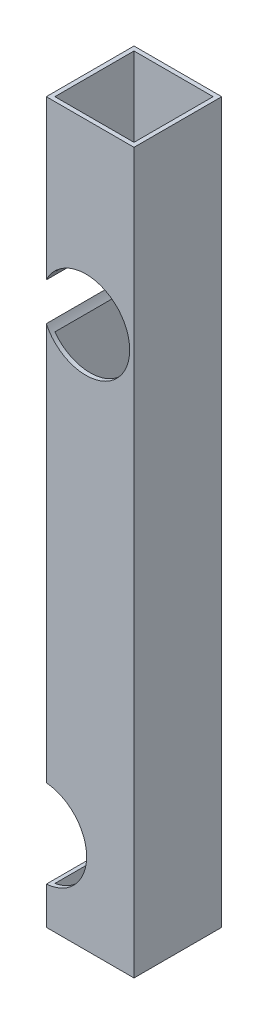
ISO-10303-21;
HEADER;
FILE_DESCRIPTION(('STEP AP214'),'2;1');
FILE_NAME('part.step','',(''),(''),'','','');
FILE_SCHEMA(('AUTOMOTIVE_DESIGN { 1 0 10303 214 1 1 1 1 }'));
ENDSEC;
DATA;
#1=APPLICATION_CONTEXT('core data for automotive mechanical design processes');
#2=APPLICATION_PROTOCOL_DEFINITION('international standard','automotive_design',2000,#1);
#3=PRODUCT_CONTEXT('',#1,'mechanical');
#4=PRODUCT('Part','Part','',(#3));
#5=PRODUCT_RELATED_PRODUCT_CATEGORY('part','',(#4));
#6=PRODUCT_DEFINITION_FORMATION('','',#4);
#7=PRODUCT_DEFINITION_CONTEXT('part definition',#1,'design');
#8=PRODUCT_DEFINITION('design','',#6,#7);
#9=PRODUCT_DEFINITION_SHAPE('','',#8);
#10=(LENGTH_UNIT() NAMED_UNIT(*) SI_UNIT(.MILLI.,.METRE.));
#11=(NAMED_UNIT(*) PLANE_ANGLE_UNIT() SI_UNIT($,.RADIAN.));
#12=(NAMED_UNIT(*) SI_UNIT($,.STERADIAN.) SOLID_ANGLE_UNIT());
#13=UNCERTAINTY_MEASURE_WITH_UNIT(LENGTH_MEASURE(1.E-05),#10,'distance_accuracy_value','');
#14=(GEOMETRIC_REPRESENTATION_CONTEXT(3) GLOBAL_UNCERTAINTY_ASSIGNED_CONTEXT((#13)) GLOBAL_UNIT_ASSIGNED_CONTEXT((#10,
#11,#12)) REPRESENTATION_CONTEXT('',''));
#15=CARTESIAN_POINT('',(0.,0.,0.));
#16=DIRECTION('',(0.,0.,1.));
#17=DIRECTION('',(1.,0.,0.));
#18=AXIS2_PLACEMENT_3D('',#15,#16,#17);
#19=CARTESIAN_POINT('',(-12.7,208.28,12.7));
#20=DIRECTION('',(1.,0.,0.));
#21=DIRECTION('',(0.,0.,-1.));
#22=AXIS2_PLACEMENT_3D('',#19,#20,#21);
#23=PLANE('',#22);
#24=DIRECTION('',(0.,-1.,0.));
#25=VECTOR('',#24,1.);
#26=CARTESIAN_POINT('',(-12.7,208.28,-12.7));
#27=LINE('',#26,#25);
#28=CARTESIAN_POINT('',(-12.7,151.361952413119,-12.7));
#29=VERTEX_POINT('',#28);
#30=CARTESIAN_POINT('',(-12.7,36.2618843829871,-12.7));
#31=VERTEX_POINT('',#30);
#32=EDGE_CURVE('E198',#29,#31,#27,.T.);
#33=ORIENTED_EDGE('',*,*,#32,.T.);
#34=DIRECTION('',(0.,0.,1.));
#35=VECTOR('',#34,1.);
#36=CARTESIAN_POINT('',(-12.7,36.2618843829871,-196.85));
#37=LINE('',#36,#35);
#38=CARTESIAN_POINT('',(-12.7,36.2618843829871,12.7));
#39=VERTEX_POINT('',#38);
#40=EDGE_CURVE('E276',#31,#39,#37,.T.);
#41=ORIENTED_EDGE('',*,*,#40,.T.);
#42=DIRECTION('',(0.,-1.,0.));
#43=VECTOR('',#42,1.);
#44=CARTESIAN_POINT('',(-12.7,208.28,12.7));
#45=LINE('',#44,#43);
#46=CARTESIAN_POINT('',(-12.7,151.361952413119,12.7));
#47=VERTEX_POINT('',#46);
#48=EDGE_CURVE('E193',#47,#39,#45,.T.);
#49=ORIENTED_EDGE('',*,*,#48,.F.);
#50=DIRECTION('',(0.,0.,1.));
#51=VECTOR('',#50,1.);
#52=CARTESIAN_POINT('',(-12.7,151.361952413119,-196.85));
#53=LINE('',#52,#51);
#54=EDGE_CURVE('E71',#47,#29,#53,.F.);
#55=ORIENTED_EDGE('',*,*,#54,.T.);
#56=EDGE_LOOP('',(#33,#41,#49,#55));
#57=FACE_BOUND('',#56,.T.);
#58=ADVANCED_FACE('F47',(#57),#23,.F.);
#59=CARTESIAN_POINT('',(-12.7,208.28,-12.7));
#60=VERTEX_POINT('',#59);
#61=CARTESIAN_POINT('',(-12.7,162.328047586881,-12.7));
#62=VERTEX_POINT('',#61);
#63=EDGE_CURVE('E183',#60,#62,#27,.T.);
#64=ORIENTED_EDGE('',*,*,#63,.T.);
#65=DIRECTION('',(0.,0.,1.));
#66=VECTOR('',#65,1.);
#67=CARTESIAN_POINT('',(-12.7,162.328047586881,-196.85));
#68=LINE('',#67,#66);
#69=CARTESIAN_POINT('',(-12.7,162.328047586881,12.7));
#70=VERTEX_POINT('',#69);
#71=EDGE_CURVE('E166',#62,#70,#68,.T.);
#72=ORIENTED_EDGE('',*,*,#71,.T.);
#73=CARTESIAN_POINT('',(-12.7,208.28,12.7));
#74=VERTEX_POINT('',#73);
#75=EDGE_CURVE('E180',#74,#70,#45,.T.);
#76=ORIENTED_EDGE('',*,*,#75,.F.);
#77=DIRECTION('',(0.,0.,1.));
#78=VECTOR('',#77,1.);
#79=CARTESIAN_POINT('',(-12.7,208.28,12.7));
#80=LINE('',#79,#78);
#81=EDGE_CURVE('E212',#60,#74,#80,.T.);
#82=ORIENTED_EDGE('',*,*,#81,.F.);
#83=EDGE_LOOP('',(#64,#72,#76,#82));
#84=FACE_BOUND('',#83,.T.);
#85=ADVANCED_FACE('F178',(#84),#23,.F.);
#86=CARTESIAN_POINT('',(-11.4554,208.28,11.4554));
#87=DIRECTION('',(1.,0.,0.));
#88=DIRECTION('',(0.,0.,-1.));
#89=AXIS2_PLACEMENT_3D('',#86,#87,#88);
#90=PLANE('',#89);
#91=DIRECTION('',(0.,0.,1.));
#92=VECTOR('',#91,1.);
#93=CARTESIAN_POINT('',(-11.4554,36.0948876326499,-196.85));
#94=LINE('',#93,#92);
#95=CARTESIAN_POINT('',(-11.4554,36.0948876326499,-11.4554));
#96=VERTEX_POINT('',#95);
#97=CARTESIAN_POINT('',(-11.4554,36.0948876326499,11.4554));
#98=VERTEX_POINT('',#97);
#99=EDGE_CURVE('E301',#96,#98,#94,.T.);
#100=ORIENTED_EDGE('',*,*,#99,.F.);
#101=DIRECTION('',(0.,-1.,0.));
#102=VECTOR('',#101,1.);
#103=CARTESIAN_POINT('',(-11.4554,208.28,-11.4554));
#104=LINE('',#103,#102);
#105=CARTESIAN_POINT('',(-11.4554,149.293207937185,-11.4554));
#106=VERTEX_POINT('',#105);
#107=EDGE_CURVE('E257',#106,#96,#104,.T.);
#108=ORIENTED_EDGE('',*,*,#107,.F.);
#109=DIRECTION('',(0.,0.,1.));
#110=VECTOR('',#109,1.);
#111=CARTESIAN_POINT('',(-11.4554,149.293207937185,-196.85));
#112=LINE('',#111,#110);
#113=CARTESIAN_POINT('',(-11.4554,149.293207937185,11.4554));
#114=VERTEX_POINT('',#113);
#115=EDGE_CURVE('E317',#114,#106,#112,.F.);
#116=ORIENTED_EDGE('',*,*,#115,.F.);
#117=DIRECTION('',(0.,-1.,0.));
#118=VECTOR('',#117,1.);
#119=CARTESIAN_POINT('',(-11.4554,208.28,11.4554));
#120=LINE('',#119,#118);
#121=EDGE_CURVE('E241',#114,#98,#120,.T.);
#122=ORIENTED_EDGE('',*,*,#121,.T.);
#123=EDGE_LOOP('',(#100,#108,#116,#122));
#124=FACE_BOUND('',#123,.T.);
#125=ADVANCED_FACE('F370',(#124),#90,.T.);
#126=DIRECTION('',(0.,0.,1.));
#127=VECTOR('',#126,1.);
#128=CARTESIAN_POINT('',(-11.4554,164.396792062815,-196.85));
#129=LINE('',#128,#127);
#130=CARTESIAN_POINT('',(-11.4554,164.396792062815,-11.4554));
#131=VERTEX_POINT('',#130);
#132=CARTESIAN_POINT('',(-11.4554,164.396792062815,11.4554));
#133=VERTEX_POINT('',#132);
#134=EDGE_CURVE('E314',#131,#133,#129,.T.);
#135=ORIENTED_EDGE('',*,*,#134,.F.);
#136=CARTESIAN_POINT('',(-11.4554,208.28,-11.4554));
#137=VERTEX_POINT('',#136);
#138=EDGE_CURVE('E253',#137,#131,#104,.T.);
#139=ORIENTED_EDGE('',*,*,#138,.F.);
#140=DIRECTION('',(0.,0.,1.));
#141=VECTOR('',#140,1.);
#142=CARTESIAN_POINT('',(-11.4554,208.28,11.4554));
#143=LINE('',#142,#141);
#144=CARTESIAN_POINT('',(-11.4554,208.28,11.4554));
#145=VERTEX_POINT('',#144);
#146=EDGE_CURVE('E263',#137,#145,#143,.T.);
#147=ORIENTED_EDGE('',*,*,#146,.T.);
#148=EDGE_CURVE('E228',#145,#133,#120,.T.);
#149=ORIENTED_EDGE('',*,*,#148,.T.);
#150=EDGE_LOOP('',(#135,#139,#147,#149));
#151=FACE_BOUND('',#150,.T.);
#152=ADVANCED_FACE('F344',(#151),#90,.T.);
#153=CARTESIAN_POINT('',(11.4554,208.28,11.4554));
#154=DIRECTION('',(0.,0.,-1.));
#155=DIRECTION('',(-1.,0.,0.));
#156=AXIS2_PLACEMENT_3D('',#153,#154,#155);
#157=PLANE('',#156);
#158=CARTESIAN_POINT('',(-1.2446,156.845,11.4554));
#159=DIRECTION('',(0.,0.,-1.));
#160=DIRECTION('',(-1.,0.,0.));
#161=AXIS2_PLACEMENT_3D('',#158,#159,#160);
#162=CIRCLE('',#161,12.7);
#163=CARTESIAN_POINT('',(11.4554,156.845,11.4554));
#164=VERTEX_POINT('',#163);
#165=EDGE_CURVE('E310',#133,#164,#162,.T.);
#166=ORIENTED_EDGE('',*,*,#165,.F.);
#167=ORIENTED_EDGE('',*,*,#148,.F.);
#168=DIRECTION('',(1.,0.,0.));
#169=VECTOR('',#168,1.);
#170=CARTESIAN_POINT('',(11.4554,208.28,11.4554));
#171=LINE('',#170,#169);
#172=CARTESIAN_POINT('',(11.4554,208.28,11.4554));
#173=VERTEX_POINT('',#172);
#174=EDGE_CURVE('E284',#145,#173,#171,.T.);
#175=ORIENTED_EDGE('',*,*,#174,.T.);
#176=DIRECTION('',(0.,-1.,0.));
#177=VECTOR('',#176,1.);
#178=CARTESIAN_POINT('',(11.4554,208.28,11.4554));
#179=LINE('',#178,#177);
#180=EDGE_CURVE('E243',#173,#164,#179,.T.);
#181=ORIENTED_EDGE('',*,*,#180,.T.);
#182=EDGE_LOOP('',(#166,#167,#175,#181));
#183=FACE_BOUND('',#182,.T.);
#184=ADVANCED_FACE('F354',(#183),#157,.T.);
#185=CARTESIAN_POINT('',(11.4554,208.28,-11.4554));
#186=DIRECTION('',(0.,0.,1.));
#187=DIRECTION('',(1.,0.,0.));
#188=AXIS2_PLACEMENT_3D('',#185,#186,#187);
#189=PLANE('',#188);
#190=CARTESIAN_POINT('',(-1.2446,156.845,-11.4554));
#191=DIRECTION('',(0.,0.,1.));
#192=DIRECTION('',(1.,0.,0.));
#193=AXIS2_PLACEMENT_3D('',#190,#191,#192);
#194=CIRCLE('',#193,12.7);
#195=CARTESIAN_POINT('',(11.4554,156.845,-11.4554));
#196=VERTEX_POINT('',#195);
#197=EDGE_CURVE('E56',#196,#131,#194,.T.);
#198=ORIENTED_EDGE('',*,*,#197,.F.);
#199=DIRECTION('',(0.,-1.,0.));
#200=VECTOR('',#199,1.);
#201=CARTESIAN_POINT('',(11.4554,208.28,-11.4554));
#202=LINE('',#201,#200);
#203=CARTESIAN_POINT('',(11.4554,208.28,-11.4554));
#204=VERTEX_POINT('',#203);
#205=EDGE_CURVE('E248',#204,#196,#202,.T.);
#206=ORIENTED_EDGE('',*,*,#205,.F.);
#207=DIRECTION('',(-1.,0.,0.));
#208=VECTOR('',#207,1.);
#209=CARTESIAN_POINT('',(11.4554,208.28,-11.4554));
#210=LINE('',#209,#208);
#211=EDGE_CURVE('E277',#204,#137,#210,.T.);
#212=ORIENTED_EDGE('',*,*,#211,.T.);
#213=ORIENTED_EDGE('',*,*,#138,.T.);
#214=EDGE_LOOP('',(#198,#206,#212,#213));
#215=FACE_BOUND('',#214,.T.);
#216=ADVANCED_FACE('F347',(#215),#189,.T.);
#217=CARTESIAN_POINT('',(0.,208.28,0.));
#218=DIRECTION('',(0.,-1.,0.));
#219=DIRECTION('',(0.,0.,-1.));
#220=AXIS2_PLACEMENT_3D('',#217,#218,#219);
#221=PLANE('',#220);
#222=DIRECTION('',(0.,0.,-1.));
#223=VECTOR('',#222,1.);
#224=CARTESIAN_POINT('',(12.7,208.28,12.7));
#225=LINE('',#224,#223);
#226=CARTESIAN_POINT('',(12.7,208.28,12.7));
#227=VERTEX_POINT('',#226);
#228=CARTESIAN_POINT('',(12.7,208.28,-12.7));
#229=VERTEX_POINT('',#228);
#230=EDGE_CURVE('E218',#227,#229,#225,.T.);
#231=ORIENTED_EDGE('',*,*,#230,.T.);
#232=DIRECTION('',(-1.,0.,0.));
#233=VECTOR('',#232,1.);
#234=CARTESIAN_POINT('',(-12.7,208.28,-12.7));
#235=LINE('',#234,#233);
#236=EDGE_CURVE('E232',#229,#60,#235,.T.);
#237=ORIENTED_EDGE('',*,*,#236,.T.);
#238=ORIENTED_EDGE('',*,*,#81,.T.);
#239=DIRECTION('',(1.,0.,0.));
#240=VECTOR('',#239,1.);
#241=CARTESIAN_POINT('',(-12.7,208.28,12.7));
#242=LINE('',#241,#240);
#243=EDGE_CURVE('E190',#74,#227,#242,.T.);
#244=ORIENTED_EDGE('',*,*,#243,.T.);
#245=EDGE_LOOP('',(#231,#237,#238,#244));
#246=FACE_BOUND('',#245,.T.);
#247=ORIENTED_EDGE('',*,*,#146,.F.);
#248=ORIENTED_EDGE('',*,*,#211,.F.);
#249=DIRECTION('',(0.,0.,-1.));
#250=VECTOR('',#249,1.);
#251=CARTESIAN_POINT('',(11.4554,208.28,11.4554));
#252=LINE('',#251,#250);
#253=EDGE_CURVE('E280',#173,#204,#252,.T.);
#254=ORIENTED_EDGE('',*,*,#253,.F.);
#255=ORIENTED_EDGE('',*,*,#174,.F.);
#256=EDGE_LOOP('',(#247,#248,#254,#255));
#257=FACE_BOUND('',#256,.T.);
#258=ADVANCED_FACE('F351',(#246,#257),#221,.F.);
#259=CARTESIAN_POINT('',(0.,0.,0.));
#260=DIRECTION('',(0.,-1.,0.));
#261=DIRECTION('',(0.,0.,-1.));
#262=AXIS2_PLACEMENT_3D('',#259,#260,#261);
#263=PLANE('',#262);
#264=DIRECTION('',(0.,0.,-1.));
#265=VECTOR('',#264,1.);
#266=CARTESIAN_POINT('',(12.7,0.,12.7));
#267=LINE('',#266,#265);
#268=CARTESIAN_POINT('',(12.7,0.,12.7));
#269=VERTEX_POINT('',#268);
#270=CARTESIAN_POINT('',(12.7,0.,-12.7));
#271=VERTEX_POINT('',#270);
#272=EDGE_CURVE('E226',#269,#271,#267,.T.);
#273=ORIENTED_EDGE('',*,*,#272,.F.);
#274=DIRECTION('',(1.,0.,0.));
#275=VECTOR('',#274,1.);
#276=CARTESIAN_POINT('',(-12.7,0.,12.7));
#277=LINE('',#276,#275);
#278=CARTESIAN_POINT('',(-12.7,0.,12.7));
#279=VERTEX_POINT('',#278);
#280=EDGE_CURVE('E215',#279,#269,#277,.T.);
#281=ORIENTED_EDGE('',*,*,#280,.F.);
#282=DIRECTION('',(0.,0.,1.));
#283=VECTOR('',#282,1.);
#284=CARTESIAN_POINT('',(-12.7,0.,12.7));
#285=LINE('',#284,#283);
#286=CARTESIAN_POINT('',(-12.7,0.,-12.7));
#287=VERTEX_POINT('',#286);
#288=EDGE_CURVE('E219',#287,#279,#285,.T.);
#289=ORIENTED_EDGE('',*,*,#288,.F.);
#290=DIRECTION('',(-1.,0.,0.));
#291=VECTOR('',#290,1.);
#292=CARTESIAN_POINT('',(-12.7,0.,-12.7));
#293=LINE('',#292,#291);
#294=EDGE_CURVE('E222',#271,#287,#293,.T.);
#295=ORIENTED_EDGE('',*,*,#294,.F.);
#296=EDGE_LOOP('',(#273,#281,#289,#295));
#297=FACE_BOUND('',#296,.T.);
#298=DIRECTION('',(-1.,0.,0.));
#299=VECTOR('',#298,1.);
#300=CARTESIAN_POINT('',(11.4554,0.,-11.4554));
#301=LINE('',#300,#299);
#302=CARTESIAN_POINT('',(11.4554,0.,-11.4554));
#303=VERTEX_POINT('',#302);
#304=CARTESIAN_POINT('',(-11.4554,0.,-11.4554));
#305=VERTEX_POINT('',#304);
#306=EDGE_CURVE('E259',#303,#305,#301,.T.);
#307=ORIENTED_EDGE('',*,*,#306,.T.);
#308=DIRECTION('',(0.,0.,1.));
#309=VECTOR('',#308,1.);
#310=CARTESIAN_POINT('',(-11.4554,0.,11.4554));
#311=LINE('',#310,#309);
#312=CARTESIAN_POINT('',(-11.4554,0.,11.4554));
#313=VERTEX_POINT('',#312);
#314=EDGE_CURVE('E272',#305,#313,#311,.T.);
#315=ORIENTED_EDGE('',*,*,#314,.T.);
#316=DIRECTION('',(1.,0.,0.));
#317=VECTOR('',#316,1.);
#318=CARTESIAN_POINT('',(11.4554,0.,11.4554));
#319=LINE('',#318,#317);
#320=CARTESIAN_POINT('',(11.4554,0.,11.4554));
#321=VERTEX_POINT('',#320);
#322=EDGE_CURVE('E268',#313,#321,#319,.T.);
#323=ORIENTED_EDGE('',*,*,#322,.T.);
#324=DIRECTION('',(0.,0.,-1.));
#325=VECTOR('',#324,1.);
#326=CARTESIAN_POINT('',(11.4554,0.,11.4554));
#327=LINE('',#326,#325);
#328=EDGE_CURVE('E264',#321,#303,#327,.T.);
#329=ORIENTED_EDGE('',*,*,#328,.T.);
#330=EDGE_LOOP('',(#307,#315,#323,#329));
#331=FACE_BOUND('',#330,.T.);
#332=ADVANCED_FACE('F392',(#297,#331),#263,.T.);
#333=CARTESIAN_POINT('',(12.7,208.28,12.7));
#334=DIRECTION('',(-1.,0.,0.));
#335=DIRECTION('',(0.,0.,1.));
#336=AXIS2_PLACEMENT_3D('',#333,#334,#335);
#337=PLANE('',#336);
#338=ORIENTED_EDGE('',*,*,#272,.T.);
#339=DIRECTION('',(0.,-1.,0.));
#340=VECTOR('',#339,1.);
#341=CARTESIAN_POINT('',(12.7,208.28,-12.7));
#342=LINE('',#341,#340);
#343=EDGE_CURVE('E328',#229,#271,#342,.T.);
#344=ORIENTED_EDGE('',*,*,#343,.F.);
#345=ORIENTED_EDGE('',*,*,#230,.F.);
#346=DIRECTION('',(0.,-1.,0.));
#347=VECTOR('',#346,1.);
#348=CARTESIAN_POINT('',(12.7,208.28,12.7));
#349=LINE('',#348,#347);
#350=EDGE_CURVE('E202',#227,#269,#349,.T.);
#351=ORIENTED_EDGE('',*,*,#350,.T.);
#352=EDGE_LOOP('',(#338,#344,#345,#351));
#353=FACE_BOUND('',#352,.T.);
#354=ADVANCED_FACE('F49',(#353),#337,.F.);
#355=CARTESIAN_POINT('',(-12.7,208.28,-12.7));
#356=DIRECTION('',(0.,0.,1.));
#357=DIRECTION('',(1.,0.,0.));
#358=AXIS2_PLACEMENT_3D('',#355,#356,#357);
#359=PLANE('',#358);
#360=CARTESIAN_POINT('',(-12.7,10.8401250369259,-12.7));
#361=VERTEX_POINT('',#360);
#362=EDGE_CURVE('E192',#361,#287,#27,.T.);
#363=ORIENTED_EDGE('',*,*,#362,.F.);
#364=CARTESIAN_POINT('',(-13.7720047099565,23.5510047099565,-12.7));
#365=DIRECTION('',(0.,0.,1.));
#366=DIRECTION('',(1.,0.,0.));
#367=AXIS2_PLACEMENT_3D('',#364,#365,#366);
#368=CIRCLE('',#367,12.7560047099565);
#369=EDGE_CURVE('E292',#361,#31,#368,.T.);
#370=ORIENTED_EDGE('',*,*,#369,.T.);
#371=ORIENTED_EDGE('',*,*,#32,.F.);
#372=CARTESIAN_POINT('',(-1.2446,156.845,-12.7));
#373=DIRECTION('',(0.,0.,1.));
#374=DIRECTION('',(1.,0.,0.));
#375=AXIS2_PLACEMENT_3D('',#372,#373,#374);
#376=CIRCLE('',#375,12.7);
#377=EDGE_CURVE('E186',#29,#62,#376,.T.);
#378=ORIENTED_EDGE('',*,*,#377,.T.);
#379=ORIENTED_EDGE('',*,*,#63,.F.);
#380=ORIENTED_EDGE('',*,*,#236,.F.);
#381=ORIENTED_EDGE('',*,*,#343,.T.);
#382=ORIENTED_EDGE('',*,*,#294,.T.);
#383=EDGE_LOOP('',(#363,#370,#371,#378,#379,#380,#381,#382));
#384=FACE_BOUND('',#383,.T.);
#385=ADVANCED_FACE('F400',(#384),#359,.F.);
#386=CARTESIAN_POINT('',(-12.7,10.8401250369259,12.7));
#387=VERTEX_POINT('',#386);
#388=EDGE_CURVE('E195',#387,#279,#45,.T.);
#389=ORIENTED_EDGE('',*,*,#388,.F.);
#390=DIRECTION('',(0.,0.,1.));
#391=VECTOR('',#390,1.);
#392=CARTESIAN_POINT('',(-12.7,10.8401250369259,-196.85));
#393=LINE('',#392,#391);
#394=EDGE_CURVE('E63',#387,#361,#393,.F.);
#395=ORIENTED_EDGE('',*,*,#394,.T.);
#396=ORIENTED_EDGE('',*,*,#362,.T.);
#397=ORIENTED_EDGE('',*,*,#288,.T.);
#398=EDGE_LOOP('',(#389,#395,#396,#397));
#399=FACE_BOUND('',#398,.T.);
#400=ADVANCED_FACE('F406',(#399),#23,.F.);
#401=CARTESIAN_POINT('',(-12.7,208.28,12.7));
#402=DIRECTION('',(0.,0.,-1.));
#403=DIRECTION('',(-1.,0.,0.));
#404=AXIS2_PLACEMENT_3D('',#401,#402,#403);
#405=PLANE('',#404);
#406=ORIENTED_EDGE('',*,*,#48,.T.);
#407=CARTESIAN_POINT('',(-13.7720047099565,23.5510047099565,12.7));
#408=DIRECTION('',(0.,0.,1.));
#409=DIRECTION('',(1.,0.,0.));
#410=AXIS2_PLACEMENT_3D('',#407,#408,#409);
#411=CIRCLE('',#410,12.7560047099565);
#412=EDGE_CURVE('E173',#387,#39,#411,.T.);
#413=ORIENTED_EDGE('',*,*,#412,.F.);
#414=ORIENTED_EDGE('',*,*,#388,.T.);
#415=ORIENTED_EDGE('',*,*,#280,.T.);
#416=ORIENTED_EDGE('',*,*,#350,.F.);
#417=ORIENTED_EDGE('',*,*,#243,.F.);
#418=ORIENTED_EDGE('',*,*,#75,.T.);
#419=CARTESIAN_POINT('',(-1.2446,156.845,12.7));
#420=DIRECTION('',(0.,0.,1.));
#421=DIRECTION('',(1.,0.,0.));
#422=AXIS2_PLACEMENT_3D('',#419,#420,#421);
#423=CIRCLE('',#422,12.7);
#424=EDGE_CURVE('E163',#47,#70,#423,.T.);
#425=ORIENTED_EDGE('',*,*,#424,.F.);
#426=EDGE_LOOP('',(#406,#413,#414,#415,#416,#417,#418,#425));
#427=FACE_BOUND('',#426,.T.);
#428=ADVANCED_FACE('F188',(#427),#405,.F.);
#429=DIRECTION('',(0.,0.,1.));
#430=VECTOR('',#429,1.);
#431=CARTESIAN_POINT('',(-11.4554,11.0071217872631,-196.85));
#432=LINE('',#431,#430);
#433=CARTESIAN_POINT('',(-11.4554,11.0071217872631,11.4554));
#434=VERTEX_POINT('',#433);
#435=CARTESIAN_POINT('',(-11.4554,11.0071217872631,-11.4554));
#436=VERTEX_POINT('',#435);
#437=EDGE_CURVE('E185',#434,#436,#432,.F.);
#438=ORIENTED_EDGE('',*,*,#437,.F.);
#439=EDGE_CURVE('E242',#434,#313,#120,.T.);
#440=ORIENTED_EDGE('',*,*,#439,.T.);
#441=ORIENTED_EDGE('',*,*,#314,.F.);
#442=EDGE_CURVE('E258',#436,#305,#104,.T.);
#443=ORIENTED_EDGE('',*,*,#442,.F.);
#444=EDGE_LOOP('',(#438,#440,#441,#443));
#445=FACE_BOUND('',#444,.T.);
#446=ADVANCED_FACE('F383',(#445),#90,.T.);
#447=CARTESIAN_POINT('',(-13.7720047099565,23.5510047099565,11.4554));
#448=DIRECTION('',(0.,0.,-1.));
#449=DIRECTION('',(-1.,0.,0.));
#450=AXIS2_PLACEMENT_3D('',#447,#448,#449);
#451=CIRCLE('',#450,12.7560047099565);
#452=EDGE_CURVE('E298',#98,#434,#451,.T.);
#453=ORIENTED_EDGE('',*,*,#452,.F.);
#454=ORIENTED_EDGE('',*,*,#121,.F.);
#455=EDGE_CURVE('E311',#164,#114,#162,.T.);
#456=ORIENTED_EDGE('',*,*,#455,.F.);
#457=EDGE_CURVE('E247',#164,#321,#179,.T.);
#458=ORIENTED_EDGE('',*,*,#457,.T.);
#459=ORIENTED_EDGE('',*,*,#322,.F.);
#460=ORIENTED_EDGE('',*,*,#439,.F.);
#461=EDGE_LOOP('',(#453,#454,#456,#458,#459,#460));
#462=FACE_BOUND('',#461,.T.);
#463=ADVANCED_FACE('F374',(#462),#157,.T.);
#464=CARTESIAN_POINT('',(11.4554,208.28,11.4554));
#465=DIRECTION('',(-1.,0.,0.));
#466=DIRECTION('',(0.,0.,1.));
#467=AXIS2_PLACEMENT_3D('',#464,#465,#466);
#468=PLANE('',#467);
#469=ORIENTED_EDGE('',*,*,#457,.F.);
#470=ORIENTED_EDGE('',*,*,#180,.F.);
#471=ORIENTED_EDGE('',*,*,#253,.T.);
#472=ORIENTED_EDGE('',*,*,#205,.T.);
#473=EDGE_CURVE('E252',#196,#303,#202,.T.);
#474=ORIENTED_EDGE('',*,*,#473,.T.);
#475=ORIENTED_EDGE('',*,*,#328,.F.);
#476=EDGE_LOOP('',(#469,#470,#471,#472,#474,#475));
#477=FACE_BOUND('',#476,.T.);
#478=ADVANCED_FACE('F390',(#477),#468,.T.);
#479=CARTESIAN_POINT('',(-13.7720047099565,23.5510047099565,-11.4554));
#480=DIRECTION('',(0.,0.,1.));
#481=DIRECTION('',(1.,0.,0.));
#482=AXIS2_PLACEMENT_3D('',#479,#480,#481);
#483=CIRCLE('',#482,12.7560047099565);
#484=EDGE_CURVE('E11',#436,#96,#483,.T.);
#485=ORIENTED_EDGE('',*,*,#484,.F.);
#486=ORIENTED_EDGE('',*,*,#442,.T.);
#487=ORIENTED_EDGE('',*,*,#306,.F.);
#488=ORIENTED_EDGE('',*,*,#473,.F.);
#489=EDGE_CURVE('E332',#106,#196,#194,.T.);
#490=ORIENTED_EDGE('',*,*,#489,.F.);
#491=ORIENTED_EDGE('',*,*,#107,.T.);
#492=EDGE_LOOP('',(#485,#486,#487,#488,#490,#491));
#493=FACE_BOUND('',#492,.T.);
#494=ADVANCED_FACE('F387',(#493),#189,.T.);
#495=CARTESIAN_POINT('',(-1.2446,156.845,-196.85));
#496=DIRECTION('',(0.,0.,1.));
#497=DIRECTION('',(1.,0.,0.));
#498=AXIS2_PLACEMENT_3D('',#495,#496,#497);
#499=CYLINDRICAL_SURFACE('',#498,12.7);
#500=ORIENTED_EDGE('',*,*,#165,.T.);
#501=ORIENTED_EDGE('',*,*,#455,.T.);
#502=ORIENTED_EDGE('',*,*,#115,.T.);
#503=ORIENTED_EDGE('',*,*,#489,.T.);
#504=ORIENTED_EDGE('',*,*,#197,.T.);
#505=ORIENTED_EDGE('',*,*,#134,.T.);
#506=EDGE_LOOP('',(#500,#501,#502,#503,#504,#505));
#507=FACE_BOUND('',#506,.T.);
#508=ORIENTED_EDGE('',*,*,#377,.F.);
#509=ORIENTED_EDGE('',*,*,#54,.F.);
#510=ORIENTED_EDGE('',*,*,#424,.T.);
#511=ORIENTED_EDGE('',*,*,#71,.F.);
#512=EDGE_LOOP('',(#508,#509,#510,#511));
#513=FACE_BOUND('',#512,.T.);
#514=ADVANCED_FACE('F165',(#507,#513),#499,.F.);
#515=CARTESIAN_POINT('',(-13.7720047099565,23.5510047099565,-196.85));
#516=DIRECTION('',(0.,0.,1.));
#517=DIRECTION('',(1.,0.,0.));
#518=AXIS2_PLACEMENT_3D('',#515,#516,#517);
#519=CYLINDRICAL_SURFACE('',#518,12.7560047099565);
#520=ORIENTED_EDGE('',*,*,#452,.T.);
#521=ORIENTED_EDGE('',*,*,#437,.T.);
#522=ORIENTED_EDGE('',*,*,#484,.T.);
#523=ORIENTED_EDGE('',*,*,#99,.T.);
#524=EDGE_LOOP('',(#520,#521,#522,#523));
#525=FACE_BOUND('',#524,.T.);
#526=ORIENTED_EDGE('',*,*,#369,.F.);
#527=ORIENTED_EDGE('',*,*,#394,.F.);
#528=ORIENTED_EDGE('',*,*,#412,.T.);
#529=ORIENTED_EDGE('',*,*,#40,.F.);
#530=EDGE_LOOP('',(#526,#527,#528,#529));
#531=FACE_BOUND('',#530,.T.);
#532=ADVANCED_FACE('F321',(#525,#531),#519,.F.);
#533=CLOSED_SHELL('',(#58,#85,#125,#152,#184,#216,#258,#332,#354,#385,#400,#428,#446,#463,#478,
#494,#514,#532));
#534=MANIFOLD_SOLID_BREP('B2',#533);
#535=ADVANCED_BREP_SHAPE_REPRESENTATION('',(#18,#534),#14);
#536=SHAPE_DEFINITION_REPRESENTATION(#9,#535);
ENDSEC;
END-ISO-10303-21;
